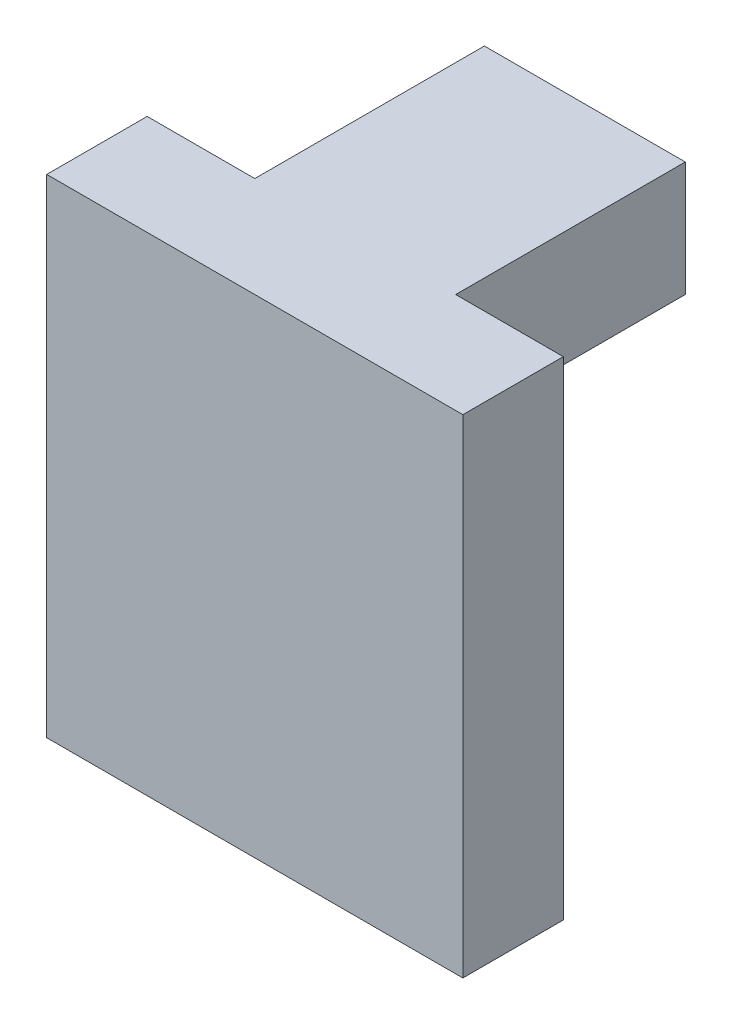
ISO-10303-21;
HEADER;
FILE_DESCRIPTION(('STEP AP214'),'2;1');
FILE_NAME('part.step','',(''),(''),'','','');
FILE_SCHEMA(('AUTOMOTIVE_DESIGN { 1 0 10303 214 1 1 1 1 }'));
ENDSEC;
DATA;
#1=APPLICATION_CONTEXT('core data for automotive mechanical design processes');
#2=APPLICATION_PROTOCOL_DEFINITION('international standard','automotive_design',2000,#1);
#3=PRODUCT_CONTEXT('',#1,'mechanical');
#4=PRODUCT('Part','Part','',(#3));
#5=PRODUCT_RELATED_PRODUCT_CATEGORY('part','',(#4));
#6=PRODUCT_DEFINITION_FORMATION('','',#4);
#7=PRODUCT_DEFINITION_CONTEXT('part definition',#1,'design');
#8=PRODUCT_DEFINITION('design','',#6,#7);
#9=PRODUCT_DEFINITION_SHAPE('','',#8);
#10=(LENGTH_UNIT() NAMED_UNIT(*) SI_UNIT(.MILLI.,.METRE.));
#11=(NAMED_UNIT(*) PLANE_ANGLE_UNIT() SI_UNIT($,.RADIAN.));
#12=(NAMED_UNIT(*) SI_UNIT($,.STERADIAN.) SOLID_ANGLE_UNIT());
#13=UNCERTAINTY_MEASURE_WITH_UNIT(LENGTH_MEASURE(1.E-05),#10,'distance_accuracy_value','');
#14=(GEOMETRIC_REPRESENTATION_CONTEXT(3) GLOBAL_UNCERTAINTY_ASSIGNED_CONTEXT((#13)) GLOBAL_UNIT_ASSIGNED_CONTEXT((#10,
#11,#12)) REPRESENTATION_CONTEXT('',''));
#15=CARTESIAN_POINT('',(0.,0.,0.));
#16=DIRECTION('',(0.,0.,1.));
#17=DIRECTION('',(1.,0.,0.));
#18=AXIS2_PLACEMENT_3D('',#15,#16,#17);
#19=CARTESIAN_POINT('',(14.5,-17.,7.));
#20=DIRECTION('',(-1.,0.,0.));
#21=DIRECTION('',(0.,0.,1.));
#22=AXIS2_PLACEMENT_3D('',#19,#20,#21);
#23=PLANE('',#22);
#24=DIRECTION('',(0.,1.,0.));
#25=VECTOR('',#24,1.);
#26=CARTESIAN_POINT('',(14.5,-17.,0.));
#27=LINE('',#26,#25);
#28=CARTESIAN_POINT('',(14.5,-17.,0.));
#29=VERTEX_POINT('',#28);
#30=CARTESIAN_POINT('',(14.5,17.,0.));
#31=VERTEX_POINT('',#30);
#32=EDGE_CURVE('E135',#29,#31,#27,.T.);
#33=ORIENTED_EDGE('',*,*,#32,.T.);
#34=DIRECTION('',(0.,0.,-1.));
#35=VECTOR('',#34,1.);
#36=CARTESIAN_POINT('',(14.5,17.,7.));
#37=LINE('',#36,#35);
#38=CARTESIAN_POINT('',(14.5,17.,7.));
#39=VERTEX_POINT('',#38);
#40=EDGE_CURVE('E11',#39,#31,#37,.T.);
#41=ORIENTED_EDGE('',*,*,#40,.F.);
#42=DIRECTION('',(0.,1.,0.));
#43=VECTOR('',#42,1.);
#44=CARTESIAN_POINT('',(14.5,-17.,7.));
#45=LINE('',#44,#43);
#46=CARTESIAN_POINT('',(14.5,-17.,7.));
#47=VERTEX_POINT('',#46);
#48=EDGE_CURVE('E145',#47,#39,#45,.T.);
#49=ORIENTED_EDGE('',*,*,#48,.F.);
#50=DIRECTION('',(0.,0.,-1.));
#51=VECTOR('',#50,1.);
#52=CARTESIAN_POINT('',(14.5,-17.,7.));
#53=LINE('',#52,#51);
#54=EDGE_CURVE('E158',#47,#29,#53,.T.);
#55=ORIENTED_EDGE('',*,*,#54,.T.);
#56=EDGE_LOOP('',(#33,#41,#49,#55));
#57=FACE_BOUND('',#56,.T.);
#58=ADVANCED_FACE('F45',(#57),#23,.F.);
#59=CARTESIAN_POINT('',(-14.5,17.,7.));
#60=DIRECTION('',(0.,-1.,0.));
#61=DIRECTION('',(0.,0.,-1.));
#62=AXIS2_PLACEMENT_3D('',#59,#60,#61);
#63=PLANE('',#62);
#64=DIRECTION('',(-1.,0.,0.));
#65=VECTOR('',#64,1.);
#66=CARTESIAN_POINT('',(-14.5,17.,0.));
#67=LINE('',#66,#65);
#68=CARTESIAN_POINT('',(7.,17.,0.));
#69=VERTEX_POINT('',#68);
#70=EDGE_CURVE('E160',#31,#69,#67,.T.);
#71=ORIENTED_EDGE('',*,*,#70,.T.);
#72=DIRECTION('',(0.,0.,1.));
#73=VECTOR('',#72,1.);
#74=CARTESIAN_POINT('',(7.,17.,-16.));
#75=LINE('',#74,#73);
#76=CARTESIAN_POINT('',(7.,17.,-16.));
#77=VERTEX_POINT('',#76);
#78=EDGE_CURVE('E196',#77,#69,#75,.T.);
#79=ORIENTED_EDGE('',*,*,#78,.F.);
#80=DIRECTION('',(1.,0.,0.));
#81=VECTOR('',#80,1.);
#82=CARTESIAN_POINT('',(7.,17.,-16.));
#83=LINE('',#82,#81);
#84=CARTESIAN_POINT('',(-7.,17.,-16.));
#85=VERTEX_POINT('',#84);
#86=EDGE_CURVE('E125',#85,#77,#83,.T.);
#87=ORIENTED_EDGE('',*,*,#86,.F.);
#88=DIRECTION('',(0.,0.,1.));
#89=VECTOR('',#88,1.);
#90=CARTESIAN_POINT('',(-7.,17.,-16.));
#91=LINE('',#90,#89);
#92=CARTESIAN_POINT('',(-7.,17.,0.));
#93=VERTEX_POINT('',#92);
#94=EDGE_CURVE('E141',#85,#93,#91,.T.);
#95=ORIENTED_EDGE('',*,*,#94,.T.);
#96=CARTESIAN_POINT('',(-14.5,17.,0.));
#97=VERTEX_POINT('',#96);
#98=EDGE_CURVE('E66',#93,#97,#67,.T.);
#99=ORIENTED_EDGE('',*,*,#98,.T.);
#100=DIRECTION('',(0.,0.,-1.));
#101=VECTOR('',#100,1.);
#102=CARTESIAN_POINT('',(-14.5,17.,7.));
#103=LINE('',#102,#101);
#104=CARTESIAN_POINT('',(-14.5,17.,7.));
#105=VERTEX_POINT('',#104);
#106=EDGE_CURVE('E53',#105,#97,#103,.T.);
#107=ORIENTED_EDGE('',*,*,#106,.F.);
#108=DIRECTION('',(-1.,0.,0.));
#109=VECTOR('',#108,1.);
#110=CARTESIAN_POINT('',(-14.5,17.,7.));
#111=LINE('',#110,#109);
#112=EDGE_CURVE('E149',#39,#105,#111,.T.);
#113=ORIENTED_EDGE('',*,*,#112,.F.);
#114=ORIENTED_EDGE('',*,*,#40,.T.);
#115=EDGE_LOOP('',(#71,#79,#87,#95,#99,#107,#113,#114));
#116=FACE_BOUND('',#115,.T.);
#117=ADVANCED_FACE('F195',(#116),#63,.F.);
#118=CARTESIAN_POINT('',(-14.5,-17.,7.));
#119=DIRECTION('',(1.,0.,0.));
#120=DIRECTION('',(0.,0.,-1.));
#121=AXIS2_PLACEMENT_3D('',#118,#119,#120);
#122=PLANE('',#121);
#123=DIRECTION('',(0.,-1.,0.));
#124=VECTOR('',#123,1.);
#125=CARTESIAN_POINT('',(-14.5,-17.,0.));
#126=LINE('',#125,#124);
#127=CARTESIAN_POINT('',(-14.5,-17.,0.));
#128=VERTEX_POINT('',#127);
#129=EDGE_CURVE('E164',#97,#128,#126,.T.);
#130=ORIENTED_EDGE('',*,*,#129,.T.);
#131=DIRECTION('',(0.,0.,-1.));
#132=VECTOR('',#131,1.);
#133=CARTESIAN_POINT('',(-14.5,-17.,7.));
#134=LINE('',#133,#132);
#135=CARTESIAN_POINT('',(-14.5,-17.,7.));
#136=VERTEX_POINT('',#135);
#137=EDGE_CURVE('E172',#136,#128,#134,.T.);
#138=ORIENTED_EDGE('',*,*,#137,.F.);
#139=DIRECTION('',(0.,-1.,0.));
#140=VECTOR('',#139,1.);
#141=CARTESIAN_POINT('',(-14.5,-17.,7.));
#142=LINE('',#141,#140);
#143=EDGE_CURVE('E153',#105,#136,#142,.T.);
#144=ORIENTED_EDGE('',*,*,#143,.F.);
#145=ORIENTED_EDGE('',*,*,#106,.T.);
#146=EDGE_LOOP('',(#130,#138,#144,#145));
#147=FACE_BOUND('',#146,.T.);
#148=ADVANCED_FACE('F180',(#147),#122,.F.);
#149=CARTESIAN_POINT('',(-14.5,-17.,7.));
#150=DIRECTION('',(0.,1.,0.));
#151=DIRECTION('',(0.,0.,1.));
#152=AXIS2_PLACEMENT_3D('',#149,#150,#151);
#153=PLANE('',#152);
#154=DIRECTION('',(1.,0.,0.));
#155=VECTOR('',#154,1.);
#156=CARTESIAN_POINT('',(-14.5,-17.,0.));
#157=LINE('',#156,#155);
#158=EDGE_CURVE('E150',#128,#29,#157,.T.);
#159=ORIENTED_EDGE('',*,*,#158,.T.);
#160=ORIENTED_EDGE('',*,*,#54,.F.);
#161=DIRECTION('',(1.,0.,0.));
#162=VECTOR('',#161,1.);
#163=CARTESIAN_POINT('',(-14.5,-17.,7.));
#164=LINE('',#163,#162);
#165=EDGE_CURVE('E156',#136,#47,#164,.T.);
#166=ORIENTED_EDGE('',*,*,#165,.F.);
#167=ORIENTED_EDGE('',*,*,#137,.T.);
#168=EDGE_LOOP('',(#159,#160,#166,#167));
#169=FACE_BOUND('',#168,.T.);
#170=ADVANCED_FACE('F188',(#169),#153,.F.);
#171=CARTESIAN_POINT('',(0.,0.,7.));
#172=DIRECTION('',(0.,0.,-1.));
#173=DIRECTION('',(-1.,0.,0.));
#174=AXIS2_PLACEMENT_3D('',#171,#172,#173);
#175=PLANE('',#174);
#176=ORIENTED_EDGE('',*,*,#48,.T.);
#177=ORIENTED_EDGE('',*,*,#112,.T.);
#178=ORIENTED_EDGE('',*,*,#143,.T.);
#179=ORIENTED_EDGE('',*,*,#165,.T.);
#180=EDGE_LOOP('',(#176,#177,#178,#179));
#181=FACE_BOUND('',#180,.T.);
#182=ADVANCED_FACE('F194',(#181),#175,.F.);
#183=CARTESIAN_POINT('',(0.,0.,0.));
#184=DIRECTION('',(0.,0.,-1.));
#185=DIRECTION('',(-1.,0.,0.));
#186=AXIS2_PLACEMENT_3D('',#183,#184,#185);
#187=PLANE('',#186);
#188=DIRECTION('',(0.,-1.,0.));
#189=VECTOR('',#188,1.);
#190=CARTESIAN_POINT('',(7.,17.,0.));
#191=LINE('',#190,#189);
#192=CARTESIAN_POINT('',(7.,9.,0.));
#193=VERTEX_POINT('',#192);
#194=EDGE_CURVE('E133',#69,#193,#191,.T.);
#195=ORIENTED_EDGE('',*,*,#194,.F.);
#196=ORIENTED_EDGE('',*,*,#70,.F.);
#197=ORIENTED_EDGE('',*,*,#32,.F.);
#198=ORIENTED_EDGE('',*,*,#158,.F.);
#199=ORIENTED_EDGE('',*,*,#129,.F.);
#200=ORIENTED_EDGE('',*,*,#98,.F.);
#201=DIRECTION('',(0.,1.,0.));
#202=VECTOR('',#201,1.);
#203=CARTESIAN_POINT('',(-7.,17.,0.));
#204=LINE('',#203,#202);
#205=CARTESIAN_POINT('',(-7.,9.,0.));
#206=VERTEX_POINT('',#205);
#207=EDGE_CURVE('E130',#206,#93,#204,.T.);
#208=ORIENTED_EDGE('',*,*,#207,.F.);
#209=DIRECTION('',(-1.,0.,0.));
#210=VECTOR('',#209,1.);
#211=CARTESIAN_POINT('',(7.,9.,0.));
#212=LINE('',#211,#210);
#213=EDGE_CURVE('E60',#193,#206,#212,.T.);
#214=ORIENTED_EDGE('',*,*,#213,.F.);
#215=EDGE_LOOP('',(#195,#196,#197,#198,#199,#200,#208,#214));
#216=FACE_BOUND('',#215,.T.);
#217=ADVANCED_FACE('F184',(#216),#187,.T.);
#218=CARTESIAN_POINT('',(7.,17.,-16.));
#219=DIRECTION('',(-1.,0.,0.));
#220=DIRECTION('',(0.,-1.,0.));
#221=AXIS2_PLACEMENT_3D('',#218,#219,#220);
#222=PLANE('',#221);
#223=ORIENTED_EDGE('',*,*,#194,.T.);
#224=DIRECTION('',(0.,0.,1.));
#225=VECTOR('',#224,1.);
#226=CARTESIAN_POINT('',(7.,9.,-16.));
#227=LINE('',#226,#225);
#228=CARTESIAN_POINT('',(7.,9.,-16.));
#229=VERTEX_POINT('',#228);
#230=EDGE_CURVE('E112',#229,#193,#227,.T.);
#231=ORIENTED_EDGE('',*,*,#230,.F.);
#232=DIRECTION('',(0.,-1.,0.));
#233=VECTOR('',#232,1.);
#234=CARTESIAN_POINT('',(7.,17.,-16.));
#235=LINE('',#234,#233);
#236=EDGE_CURVE('E120',#77,#229,#235,.T.);
#237=ORIENTED_EDGE('',*,*,#236,.F.);
#238=ORIENTED_EDGE('',*,*,#78,.T.);
#239=EDGE_LOOP('',(#223,#231,#237,#238));
#240=FACE_BOUND('',#239,.T.);
#241=ADVANCED_FACE('F132',(#240),#222,.F.);
#242=CARTESIAN_POINT('',(7.,9.,-16.));
#243=DIRECTION('',(0.,1.,0.));
#244=DIRECTION('',(0.,0.,1.));
#245=AXIS2_PLACEMENT_3D('',#242,#243,#244);
#246=PLANE('',#245);
#247=ORIENTED_EDGE('',*,*,#213,.T.);
#248=DIRECTION('',(0.,0.,1.));
#249=VECTOR('',#248,1.);
#250=CARTESIAN_POINT('',(-7.,9.,-16.));
#251=LINE('',#250,#249);
#252=CARTESIAN_POINT('',(-7.,9.,-16.));
#253=VERTEX_POINT('',#252);
#254=EDGE_CURVE('E115',#253,#206,#251,.T.);
#255=ORIENTED_EDGE('',*,*,#254,.F.);
#256=DIRECTION('',(-1.,0.,0.));
#257=VECTOR('',#256,1.);
#258=CARTESIAN_POINT('',(7.,9.,-16.));
#259=LINE('',#258,#257);
#260=EDGE_CURVE('E108',#229,#253,#259,.T.);
#261=ORIENTED_EDGE('',*,*,#260,.F.);
#262=ORIENTED_EDGE('',*,*,#230,.T.);
#263=EDGE_LOOP('',(#247,#255,#261,#262));
#264=FACE_BOUND('',#263,.T.);
#265=ADVANCED_FACE('F110',(#264),#246,.F.);
#266=CARTESIAN_POINT('',(-7.,17.,-16.));
#267=DIRECTION('',(1.,0.,0.));
#268=DIRECTION('',(0.,1.,0.));
#269=AXIS2_PLACEMENT_3D('',#266,#267,#268);
#270=PLANE('',#269);
#271=ORIENTED_EDGE('',*,*,#207,.T.);
#272=ORIENTED_EDGE('',*,*,#94,.F.);
#273=DIRECTION('',(0.,1.,0.));
#274=VECTOR('',#273,1.);
#275=CARTESIAN_POINT('',(-7.,17.,-16.));
#276=LINE('',#275,#274);
#277=EDGE_CURVE('E119',#253,#85,#276,.T.);
#278=ORIENTED_EDGE('',*,*,#277,.F.);
#279=ORIENTED_EDGE('',*,*,#254,.T.);
#280=EDGE_LOOP('',(#271,#272,#278,#279));
#281=FACE_BOUND('',#280,.T.);
#282=ADVANCED_FACE('F213',(#281),#270,.F.);
#283=CARTESIAN_POINT('',(0.,0.,-16.));
#284=DIRECTION('',(0.,0.,-1.));
#285=DIRECTION('',(-1.,0.,0.));
#286=AXIS2_PLACEMENT_3D('',#283,#284,#285);
#287=PLANE('',#286);
#288=ORIENTED_EDGE('',*,*,#236,.T.);
#289=ORIENTED_EDGE('',*,*,#260,.T.);
#290=ORIENTED_EDGE('',*,*,#277,.T.);
#291=ORIENTED_EDGE('',*,*,#86,.T.);
#292=EDGE_LOOP('',(#288,#289,#290,#291));
#293=FACE_BOUND('',#292,.T.);
#294=ADVANCED_FACE('F123',(#293),#287,.T.);
#295=CLOSED_SHELL('',(#58,#117,#148,#170,#182,#217,#241,#265,#282,#294));
#296=MANIFOLD_SOLID_BREP('B2',#295);
#297=ADVANCED_BREP_SHAPE_REPRESENTATION('',(#18,#296),#14);
#298=SHAPE_DEFINITION_REPRESENTATION(#9,#297);
ENDSEC;
END-ISO-10303-21;
